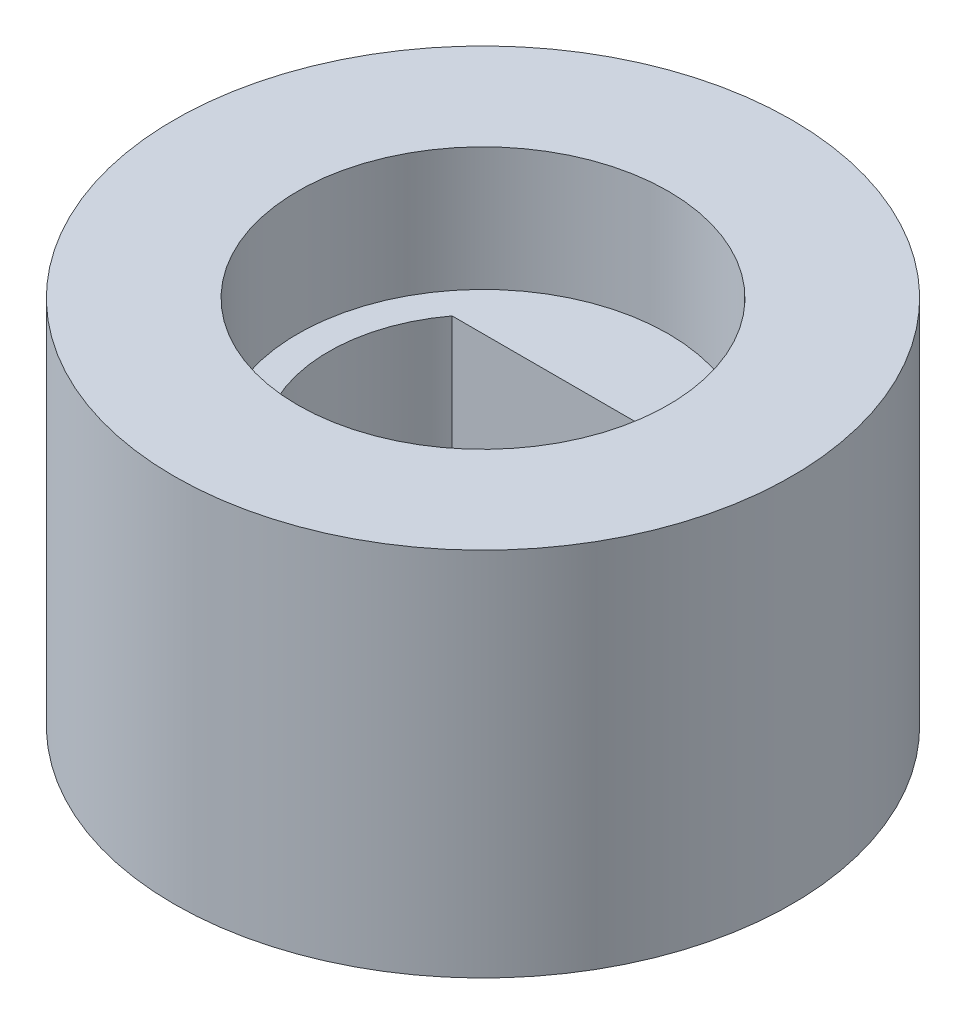
ISO-10303-21;
HEADER;
FILE_DESCRIPTION(('STEP AP214'),'2;1');
FILE_NAME('part.step','',(''),(''),'','','');
FILE_SCHEMA(('AUTOMOTIVE_DESIGN { 1 0 10303 214 1 1 1 1 }'));
ENDSEC;
DATA;
#1=APPLICATION_CONTEXT('core data for automotive mechanical design processes');
#2=APPLICATION_PROTOCOL_DEFINITION('international standard','automotive_design',2000,#1);
#3=PRODUCT_CONTEXT('',#1,'mechanical');
#4=PRODUCT('Part','Part','',(#3));
#5=PRODUCT_RELATED_PRODUCT_CATEGORY('part','',(#4));
#6=PRODUCT_DEFINITION_FORMATION('','',#4);
#7=PRODUCT_DEFINITION_CONTEXT('part definition',#1,'design');
#8=PRODUCT_DEFINITION('design','',#6,#7);
#9=PRODUCT_DEFINITION_SHAPE('','',#8);
#10=(LENGTH_UNIT() NAMED_UNIT(*) SI_UNIT(.MILLI.,.METRE.));
#11=(NAMED_UNIT(*) PLANE_ANGLE_UNIT() SI_UNIT($,.RADIAN.));
#12=(NAMED_UNIT(*) SI_UNIT($,.STERADIAN.) SOLID_ANGLE_UNIT());
#13=UNCERTAINTY_MEASURE_WITH_UNIT(LENGTH_MEASURE(1.E-05),#10,'distance_accuracy_value','');
#14=(GEOMETRIC_REPRESENTATION_CONTEXT(3) GLOBAL_UNCERTAINTY_ASSIGNED_CONTEXT((#13)) GLOBAL_UNIT_ASSIGNED_CONTEXT((#10,
#11,#12)) REPRESENTATION_CONTEXT('',''));
#15=CARTESIAN_POINT('',(0.,0.,0.));
#16=DIRECTION('',(0.,0.,1.));
#17=DIRECTION('',(1.,0.,0.));
#18=AXIS2_PLACEMENT_3D('',#15,#16,#17);
#19=CARTESIAN_POINT('',(0.,4.,0.));
#20=DIRECTION('',(0.,1.,0.));
#21=DIRECTION('',(0.,0.,1.));
#22=AXIS2_PLACEMENT_3D('',#19,#20,#21);
#23=PLANE('',#22);
#24=CARTESIAN_POINT('',(0.,4.,0.));
#25=DIRECTION('',(0.,1.,0.));
#26=DIRECTION('',(0.,0.,1.));
#27=AXIS2_PLACEMENT_3D('',#24,#25,#26);
#28=CIRCLE('',#27,2.5);
#29=CARTESIAN_POINT('',(-2.,4.,-1.5));
#30=VERTEX_POINT('',#29);
#31=CARTESIAN_POINT('',(2.,4.,-1.5));
#32=VERTEX_POINT('',#31);
#33=EDGE_CURVE('E73',#30,#32,#28,.T.);
#34=ORIENTED_EDGE('',*,*,#33,.F.);
#35=DIRECTION('',(1.,0.,0.));
#36=VECTOR('',#35,1.);
#37=CARTESIAN_POINT('',(0.,4.,-1.5));
#38=LINE('',#37,#36);
#39=EDGE_CURVE('E58',#30,#32,#38,.T.);
#40=ORIENTED_EDGE('',*,*,#39,.T.);
#41=EDGE_LOOP('',(#34,#40));
#42=FACE_BOUND('',#41,.T.);
#43=CARTESIAN_POINT('',(0.,4.,0.));
#44=DIRECTION('',(0.,1.,0.));
#45=DIRECTION('',(0.,0.,1.));
#46=AXIS2_PLACEMENT_3D('',#43,#44,#45);
#47=CIRCLE('',#46,3.);
#48=CARTESIAN_POINT('',(0.,4.,3.));
#49=VERTEX_POINT('',#48);
#50=EDGE_CURVE('E90',#49,#49,#47,.T.);
#51=ORIENTED_EDGE('',*,*,#50,.T.);
#52=EDGE_LOOP('',(#51));
#53=FACE_BOUND('',#52,.T.);
#54=ADVANCED_FACE('F42',(#42,#53),#23,.T.);
#55=CARTESIAN_POINT('',(0.,4.,0.));
#56=DIRECTION('',(0.,-1.,0.));
#57=DIRECTION('',(0.,0.,-1.));
#58=AXIS2_PLACEMENT_3D('',#55,#56,#57);
#59=CYLINDRICAL_SURFACE('',#58,2.5);
#60=CARTESIAN_POINT('',(0.,0.,0.));
#61=DIRECTION('',(0.,1.,0.));
#62=DIRECTION('',(0.,0.,1.));
#63=AXIS2_PLACEMENT_3D('',#60,#61,#62);
#64=CIRCLE('',#63,2.5);
#65=CARTESIAN_POINT('',(-2.,0.,-1.5));
#66=VERTEX_POINT('',#65);
#67=CARTESIAN_POINT('',(2.,0.,-1.5));
#68=VERTEX_POINT('',#67);
#69=EDGE_CURVE('E72',#66,#68,#64,.T.);
#70=ORIENTED_EDGE('',*,*,#69,.F.);
#71=DIRECTION('',(0.,-1.,0.));
#72=VECTOR('',#71,1.);
#73=CARTESIAN_POINT('',(-2.,4.,-1.5));
#74=LINE('',#73,#72);
#75=EDGE_CURVE('E12',#30,#66,#74,.T.);
#76=ORIENTED_EDGE('',*,*,#75,.F.);
#77=ORIENTED_EDGE('',*,*,#33,.T.);
#78=DIRECTION('',(0.,-1.,0.));
#79=VECTOR('',#78,1.);
#80=CARTESIAN_POINT('',(2.,4.,-1.5));
#81=LINE('',#80,#79);
#82=EDGE_CURVE('E51',#32,#68,#81,.T.);
#83=ORIENTED_EDGE('',*,*,#82,.T.);
#84=EDGE_LOOP('',(#70,#76,#77,#83));
#85=FACE_BOUND('',#84,.T.);
#86=ADVANCED_FACE('F70',(#85),#59,.F.);
#87=CARTESIAN_POINT('',(0.,4.,0.));
#88=DIRECTION('',(0.,-1.,0.));
#89=DIRECTION('',(0.,0.,-1.));
#90=AXIS2_PLACEMENT_3D('',#87,#88,#89);
#91=CYLINDRICAL_SURFACE('',#90,5.);
#92=CARTESIAN_POINT('',(0.,0.,0.));
#93=DIRECTION('',(0.,1.,0.));
#94=DIRECTION('',(0.,0.,1.));
#95=AXIS2_PLACEMENT_3D('',#92,#93,#94);
#96=CIRCLE('',#95,5.);
#97=CARTESIAN_POINT('',(0.,0.,5.));
#98=VERTEX_POINT('',#97);
#99=EDGE_CURVE('E79',#98,#98,#96,.T.);
#100=ORIENTED_EDGE('',*,*,#99,.T.);
#101=EDGE_LOOP('',(#100));
#102=FACE_BOUND('',#101,.T.);
#103=CARTESIAN_POINT('',(0.,6.,0.));
#104=DIRECTION('',(0.,1.,0.));
#105=DIRECTION('',(0.,0.,1.));
#106=AXIS2_PLACEMENT_3D('',#103,#104,#105);
#107=CIRCLE('',#106,5.);
#108=CARTESIAN_POINT('',(0.,6.,5.));
#109=VERTEX_POINT('',#108);
#110=EDGE_CURVE('E82',#109,#109,#107,.T.);
#111=ORIENTED_EDGE('',*,*,#110,.F.);
#112=EDGE_LOOP('',(#111));
#113=FACE_BOUND('',#112,.T.);
#114=ADVANCED_FACE('F44',(#102,#113),#91,.T.);
#115=CARTESIAN_POINT('',(0.,4.,-1.5));
#116=DIRECTION('',(0.,0.,-1.));
#117=DIRECTION('',(-1.,0.,0.));
#118=AXIS2_PLACEMENT_3D('',#115,#116,#117);
#119=PLANE('',#118);
#120=DIRECTION('',(1.,0.,0.));
#121=VECTOR('',#120,1.);
#122=CARTESIAN_POINT('',(0.,0.,-1.5));
#123=LINE('',#122,#121);
#124=EDGE_CURVE('E74',#66,#68,#123,.T.);
#125=ORIENTED_EDGE('',*,*,#124,.T.);
#126=ORIENTED_EDGE('',*,*,#82,.F.);
#127=ORIENTED_EDGE('',*,*,#39,.F.);
#128=ORIENTED_EDGE('',*,*,#75,.T.);
#129=EDGE_LOOP('',(#125,#126,#127,#128));
#130=FACE_BOUND('',#129,.T.);
#131=ADVANCED_FACE('F75',(#130),#119,.F.);
#132=CARTESIAN_POINT('',(0.,0.,0.));
#133=DIRECTION('',(0.,1.,0.));
#134=DIRECTION('',(0.,0.,1.));
#135=AXIS2_PLACEMENT_3D('',#132,#133,#134);
#136=PLANE('',#135);
#137=ORIENTED_EDGE('',*,*,#99,.F.);
#138=EDGE_LOOP('',(#137));
#139=FACE_BOUND('',#138,.T.);
#140=ORIENTED_EDGE('',*,*,#69,.T.);
#141=ORIENTED_EDGE('',*,*,#124,.F.);
#142=EDGE_LOOP('',(#140,#141));
#143=FACE_BOUND('',#142,.T.);
#144=ADVANCED_FACE('F78',(#139,#143),#136,.F.);
#145=CARTESIAN_POINT('',(0.,6.,0.));
#146=DIRECTION('',(0.,1.,0.));
#147=DIRECTION('',(0.,0.,1.));
#148=AXIS2_PLACEMENT_3D('',#145,#146,#147);
#149=PLANE('',#148);
#150=ORIENTED_EDGE('',*,*,#110,.T.);
#151=EDGE_LOOP('',(#150));
#152=FACE_BOUND('',#151,.T.);
#153=CARTESIAN_POINT('',(0.,6.,0.));
#154=DIRECTION('',(0.,1.,0.));
#155=DIRECTION('',(0.,0.,1.));
#156=AXIS2_PLACEMENT_3D('',#153,#154,#155);
#157=CIRCLE('',#156,3.);
#158=CARTESIAN_POINT('',(0.,6.,3.));
#159=VERTEX_POINT('',#158);
#160=EDGE_CURVE('E89',#159,#159,#157,.T.);
#161=ORIENTED_EDGE('',*,*,#160,.F.);
#162=EDGE_LOOP('',(#161));
#163=FACE_BOUND('',#162,.T.);
#164=ADVANCED_FACE('F99',(#152,#163),#149,.T.);
#165=CARTESIAN_POINT('',(0.,6.,0.));
#166=DIRECTION('',(0.,-1.,0.));
#167=DIRECTION('',(0.,0.,-1.));
#168=AXIS2_PLACEMENT_3D('',#165,#166,#167);
#169=CYLINDRICAL_SURFACE('',#168,3.);
#170=ORIENTED_EDGE('',*,*,#160,.T.);
#171=EDGE_LOOP('',(#170));
#172=FACE_BOUND('',#171,.T.);
#173=ORIENTED_EDGE('',*,*,#50,.F.);
#174=EDGE_LOOP('',(#173));
#175=FACE_BOUND('',#174,.T.);
#176=ADVANCED_FACE('F96',(#172,#175),#169,.F.);
#177=CLOSED_SHELL('',(#54,#86,#114,#131,#144,#164,#176));
#178=MANIFOLD_SOLID_BREP('B2',#177);
#179=ADVANCED_BREP_SHAPE_REPRESENTATION('',(#18,#178),#14);
#180=SHAPE_DEFINITION_REPRESENTATION(#9,#179);
ENDSEC;
END-ISO-10303-21;
